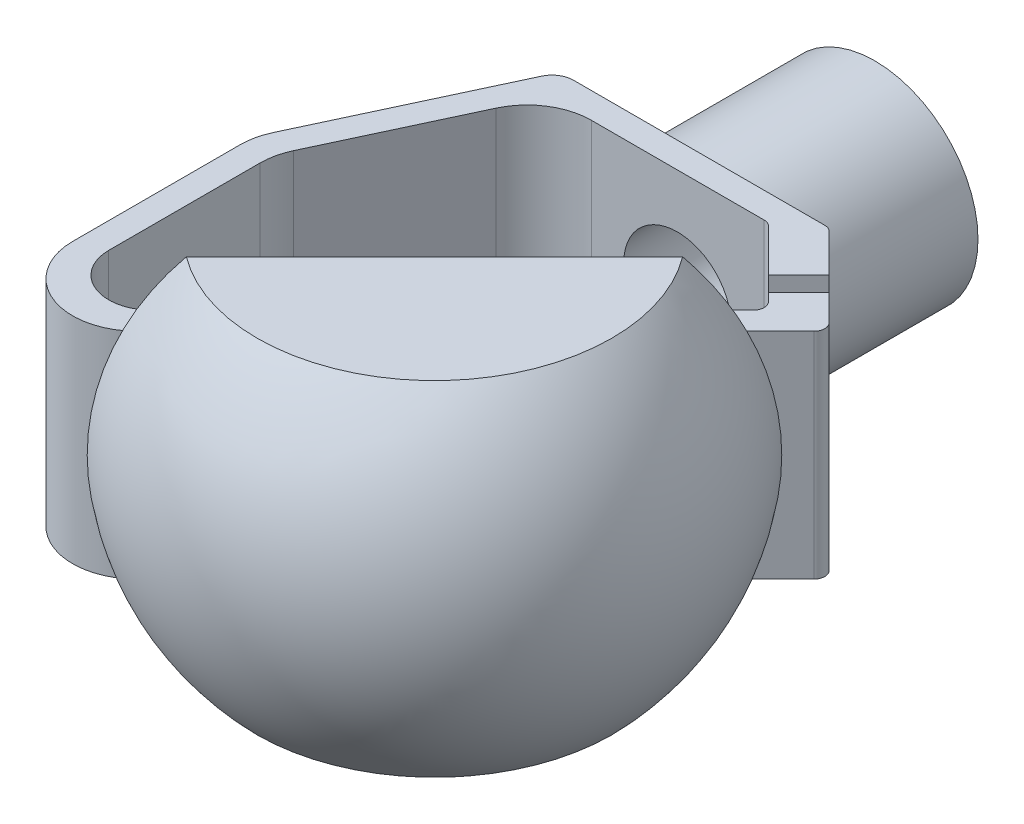
ISO-10303-21;
HEADER;
FILE_DESCRIPTION(('STEP AP214'),'2;1');
FILE_NAME('part.step','',(''),(''),'','','');
FILE_SCHEMA(('AUTOMOTIVE_DESIGN { 1 0 10303 214 1 1 1 1 }'));
ENDSEC;
DATA;
#1=APPLICATION_CONTEXT('core data for automotive mechanical design processes');
#2=APPLICATION_PROTOCOL_DEFINITION('international standard','automotive_design',2000,#1);
#3=PRODUCT_CONTEXT('',#1,'mechanical');
#4=PRODUCT('Part','Part','',(#3));
#5=PRODUCT_RELATED_PRODUCT_CATEGORY('part','',(#4));
#6=PRODUCT_DEFINITION_FORMATION('','',#4);
#7=PRODUCT_DEFINITION_CONTEXT('part definition',#1,'design');
#8=PRODUCT_DEFINITION('design','',#6,#7);
#9=PRODUCT_DEFINITION_SHAPE('','',#8);
#10=(LENGTH_UNIT() NAMED_UNIT(*) SI_UNIT(.MILLI.,.METRE.));
#11=(NAMED_UNIT(*) PLANE_ANGLE_UNIT() SI_UNIT($,.RADIAN.));
#12=(NAMED_UNIT(*) SI_UNIT($,.STERADIAN.) SOLID_ANGLE_UNIT());
#13=UNCERTAINTY_MEASURE_WITH_UNIT(LENGTH_MEASURE(1.E-05),#10,'distance_accuracy_value','');
#14=(GEOMETRIC_REPRESENTATION_CONTEXT(3) GLOBAL_UNCERTAINTY_ASSIGNED_CONTEXT((#13)) GLOBAL_UNIT_ASSIGNED_CONTEXT((#10,
#11,#12)) REPRESENTATION_CONTEXT('',''));
#15=CARTESIAN_POINT('',(0.,0.,0.));
#16=DIRECTION('',(0.,0.,1.));
#17=DIRECTION('',(1.,0.,0.));
#18=AXIS2_PLACEMENT_3D('',#15,#16,#17);
#19=CARTESIAN_POINT('',(0.,0.,0.));
#20=DIRECTION('',(0.,0.,-1.));
#21=DIRECTION('',(-1.,0.,0.));
#22=AXIS2_PLACEMENT_3D('',#19,#20,#21);
#23=PLANE('',#22);
#24=CARTESIAN_POINT('',(0.,0.,0.));
#25=DIRECTION('',(0.,0.,-1.));
#26=DIRECTION('',(-1.,0.,0.));
#27=AXIS2_PLACEMENT_3D('',#24,#25,#26);
#28=CIRCLE('',#27,1.25);
#29=CARTESIAN_POINT('',(-1.25,0.,0.));
#30=VERTEX_POINT('',#29);
#31=EDGE_CURVE('E232',#30,#30,#28,.T.);
#32=ORIENTED_EDGE('',*,*,#31,.F.);
#33=EDGE_LOOP('',(#32));
#34=FACE_BOUND('',#33,.T.);
#35=CARTESIAN_POINT('',(0.,0.,0.));
#36=DIRECTION('',(0.,0.,-1.));
#37=DIRECTION('',(-1.,0.,0.));
#38=AXIS2_PLACEMENT_3D('',#35,#36,#37);
#39=CIRCLE('',#38,2.4);
#40=CARTESIAN_POINT('',(-2.4,0.,0.));
#41=VERTEX_POINT('',#40);
#42=EDGE_CURVE('E412',#41,#41,#39,.T.);
#43=ORIENTED_EDGE('',*,*,#42,.T.);
#44=EDGE_LOOP('',(#43));
#45=FACE_BOUND('',#44,.T.);
#46=ADVANCED_FACE('F38',(#34,#45),#23,.T.);
#47=CARTESIAN_POINT('',(0.,0.,-4.09454545454545));
#48=DIRECTION('',(0.,0.,-1.));
#49=DIRECTION('',(-1.,0.,0.));
#50=AXIS2_PLACEMENT_3D('',#47,#48,#49);
#51=CYLINDRICAL_SURFACE('',#50,2.4);
#52=CARTESIAN_POINT('',(0.,0.,4.));
#53=DIRECTION('',(0.,0.,1.));
#54=DIRECTION('',(1.,0.,0.));
#55=AXIS2_PLACEMENT_3D('',#52,#53,#54);
#56=CIRCLE('',#55,2.4);
#57=CARTESIAN_POINT('',(2.4,0.,4.));
#58=VERTEX_POINT('',#57);
#59=EDGE_CURVE('E409',#58,#58,#56,.F.);
#60=ORIENTED_EDGE('',*,*,#59,.T.);
#61=EDGE_LOOP('',(#60));
#62=FACE_BOUND('',#61,.T.);
#63=ORIENTED_EDGE('',*,*,#42,.F.);
#64=EDGE_LOOP('',(#63));
#65=FACE_BOUND('',#64,.T.);
#66=ADVANCED_FACE('F436',(#62,#65),#51,.T.);
#67=CARTESIAN_POINT('',(0.,2.5,4.));
#68=DIRECTION('',(0.,0.,1.));
#69=DIRECTION('',(1.,0.,0.));
#70=AXIS2_PLACEMENT_3D('',#67,#68,#69);
#71=PLANE('',#70);
#72=ORIENTED_EDGE('',*,*,#59,.F.);
#73=EDGE_LOOP('',(#72));
#74=FACE_BOUND('',#73,.T.);
#75=DIRECTION('',(-1.,0.,0.));
#76=VECTOR('',#75,1.);
#77=CARTESIAN_POINT('',(0.,-2.5,4.));
#78=LINE('',#77,#76);
#79=CARTESIAN_POINT('',(2.83198051533945,-2.5,4.));
#80=VERTEX_POINT('',#79);
#81=CARTESIAN_POINT('',(-3.01931241729199,-2.5,4.));
#82=VERTEX_POINT('',#81);
#83=EDGE_CURVE('E288',#80,#82,#78,.T.);
#84=ORIENTED_EDGE('',*,*,#83,.T.);
#85=DIRECTION('',(0.,-1.,0.));
#86=VECTOR('',#85,1.);
#87=CARTESIAN_POINT('',(-3.01931241729199,2.5,4.));
#88=LINE('',#87,#86);
#89=CARTESIAN_POINT('',(-3.01931241729199,2.5,4.));
#90=VERTEX_POINT('',#89);
#91=EDGE_CURVE('E406',#90,#82,#88,.T.);
#92=ORIENTED_EDGE('',*,*,#91,.F.);
#93=DIRECTION('',(-1.,0.,0.));
#94=VECTOR('',#93,1.);
#95=CARTESIAN_POINT('',(2.83198051533945,2.5,4.));
#96=LINE('',#95,#94);
#97=CARTESIAN_POINT('',(2.83198051533945,2.5,4.));
#98=VERTEX_POINT('',#97);
#99=EDGE_CURVE('E236',#98,#90,#96,.T.);
#100=ORIENTED_EDGE('',*,*,#99,.F.);
#101=DIRECTION('',(0.,-1.,0.));
#102=VECTOR('',#101,1.);
#103=CARTESIAN_POINT('',(2.83198051533945,2.5,4.));
#104=LINE('',#103,#102);
#105=EDGE_CURVE('E287',#98,#80,#104,.T.);
#106=ORIENTED_EDGE('',*,*,#105,.T.);
#107=EDGE_LOOP('',(#84,#92,#100,#106));
#108=FACE_BOUND('',#107,.T.);
#109=ADVANCED_FACE('F441',(#74,#108),#71,.F.);
#110=CARTESIAN_POINT('',(-3.01931241729199,2.5,4.5));
#111=DIRECTION('',(0.,-1.,0.));
#112=DIRECTION('',(0.,0.,-1.));
#113=AXIS2_PLACEMENT_3D('',#110,#111,#112);
#114=CYLINDRICAL_SURFACE('',#113,0.5);
#115=CARTESIAN_POINT('',(-3.01931241729199,-2.5,4.5));
#116=DIRECTION('',(0.,1.,0.));
#117=DIRECTION('',(0.,0.,1.));
#118=AXIS2_PLACEMENT_3D('',#115,#116,#117);
#119=CIRCLE('',#118,0.5);
#120=CARTESIAN_POINT('',(-3.47246631081032,-2.5,4.28869086912965));
#121=VERTEX_POINT('',#120);
#122=EDGE_CURVE('E290',#82,#121,#119,.T.);
#123=ORIENTED_EDGE('',*,*,#122,.T.);
#124=DIRECTION('',(0.,-1.,0.));
#125=VECTOR('',#124,1.);
#126=CARTESIAN_POINT('',(-3.47246631081032,2.5,4.28869086912965));
#127=LINE('',#126,#125);
#128=CARTESIAN_POINT('',(-3.47246631081032,2.5,4.28869086912965));
#129=VERTEX_POINT('',#128);
#130=EDGE_CURVE('E403',#129,#121,#127,.T.);
#131=ORIENTED_EDGE('',*,*,#130,.F.);
#132=CARTESIAN_POINT('',(-3.01931241729199,2.5,4.5));
#133=DIRECTION('',(0.,1.,0.));
#134=DIRECTION('',(0.,0.,1.));
#135=AXIS2_PLACEMENT_3D('',#132,#133,#134);
#136=CIRCLE('',#135,0.5);
#137=EDGE_CURVE('E238',#90,#129,#136,.T.);
#138=ORIENTED_EDGE('',*,*,#137,.F.);
#139=ORIENTED_EDGE('',*,*,#91,.T.);
#140=EDGE_LOOP('',(#123,#131,#138,#139));
#141=FACE_BOUND('',#140,.T.);
#142=ADVANCED_FACE('F450',(#141),#114,.T.);
#143=CARTESIAN_POINT('',(-3.47246631081032,2.5,4.28869086912965));
#144=DIRECTION('',(0.906307787036651,0.,0.422618261740697));
#145=DIRECTION('',(0.422618261740697,0.,-0.906307787036651));
#146=AXIS2_PLACEMENT_3D('',#143,#144,#145);
#147=PLANE('',#146);
#148=DIRECTION('',(-0.422618261740697,0.,0.906307787036651));
#149=VECTOR('',#148,1.);
#150=CARTESIAN_POINT('',(-3.47246631081032,-2.5,4.28869086912965));
#151=LINE('',#150,#149);
#152=CARTESIAN_POINT('',(-5.45946168055498,-2.5,8.54981619056755));
#153=VERTEX_POINT('',#152);
#154=EDGE_CURVE('E292',#121,#153,#151,.T.);
#155=ORIENTED_EDGE('',*,*,#154,.T.);
#156=DIRECTION('',(0.,-1.,0.));
#157=VECTOR('',#156,1.);
#158=CARTESIAN_POINT('',(-5.45946168055498,2.5,8.54981619056755));
#159=LINE('',#158,#157);
#160=CARTESIAN_POINT('',(-5.45946168055498,2.5,8.54981619056755));
#161=VERTEX_POINT('',#160);
#162=EDGE_CURVE('E400',#161,#153,#159,.T.);
#163=ORIENTED_EDGE('',*,*,#162,.F.);
#164=DIRECTION('',(-0.422618261740697,0.,0.906307787036651));
#165=VECTOR('',#164,1.);
#166=CARTESIAN_POINT('',(-3.47246631081032,2.5,4.28869086912965));
#167=LINE('',#166,#165);
#168=EDGE_CURVE('E241',#129,#161,#167,.T.);
#169=ORIENTED_EDGE('',*,*,#168,.F.);
#170=ORIENTED_EDGE('',*,*,#130,.T.);
#171=EDGE_LOOP('',(#155,#163,#169,#170));
#172=FACE_BOUND('',#171,.T.);
#173=ADVANCED_FACE('F456',(#172),#147,.F.);
#174=CARTESIAN_POINT('',(-4.1,2.5,9.18374358317859));
#175=DIRECTION('',(0.,-1.,0.));
#176=DIRECTION('',(0.,0.,-1.));
#177=AXIS2_PLACEMENT_3D('',#174,#175,#176);
#178=CYLINDRICAL_SURFACE('',#177,1.5);
#179=CARTESIAN_POINT('',(-4.1,-2.5,9.18374358317859));
#180=DIRECTION('',(0.,1.,0.));
#181=DIRECTION('',(0.,0.,1.));
#182=AXIS2_PLACEMENT_3D('',#179,#180,#181);
#183=CIRCLE('',#182,1.5);
#184=CARTESIAN_POINT('',(-5.6,-2.5,9.18374358317859));
#185=VERTEX_POINT('',#184);
#186=EDGE_CURVE('E294',#153,#185,#183,.T.);
#187=ORIENTED_EDGE('',*,*,#186,.T.);
#188=DIRECTION('',(0.,-1.,0.));
#189=VECTOR('',#188,1.);
#190=CARTESIAN_POINT('',(-5.6,2.5,9.18374358317859));
#191=LINE('',#190,#189);
#192=CARTESIAN_POINT('',(-5.6,2.5,9.18374358317859));
#193=VERTEX_POINT('',#192);
#194=EDGE_CURVE('E397',#193,#185,#191,.T.);
#195=ORIENTED_EDGE('',*,*,#194,.F.);
#196=CARTESIAN_POINT('',(-4.1,2.5,9.18374358317859));
#197=DIRECTION('',(0.,1.,0.));
#198=DIRECTION('',(0.,0.,1.));
#199=AXIS2_PLACEMENT_3D('',#196,#197,#198);
#200=CIRCLE('',#199,1.5);
#201=EDGE_CURVE('E243',#161,#193,#200,.T.);
#202=ORIENTED_EDGE('',*,*,#201,.F.);
#203=ORIENTED_EDGE('',*,*,#162,.T.);
#204=EDGE_LOOP('',(#187,#195,#202,#203));
#205=FACE_BOUND('',#204,.T.);
#206=ADVANCED_FACE('F460',(#205),#178,.T.);
#207=CARTESIAN_POINT('',(-5.6,2.5,9.18374358317859));
#208=DIRECTION('',(1.,0.,0.));
#209=DIRECTION('',(0.,0.,-1.));
#210=AXIS2_PLACEMENT_3D('',#207,#208,#209);
#211=PLANE('',#210);
#212=DIRECTION('',(0.,0.,1.));
#213=VECTOR('',#212,1.);
#214=CARTESIAN_POINT('',(-5.6,-2.5,9.18374358317859));
#215=LINE('',#214,#213);
#216=CARTESIAN_POINT('',(-5.6,-2.5,13.0840620433564));
#217=VERTEX_POINT('',#216);
#218=EDGE_CURVE('E296',#185,#217,#215,.T.);
#219=ORIENTED_EDGE('',*,*,#218,.T.);
#220=DIRECTION('',(0.,-1.,0.));
#221=VECTOR('',#220,1.);
#222=CARTESIAN_POINT('',(-5.6,2.5,13.0840620433564));
#223=LINE('',#222,#221);
#224=CARTESIAN_POINT('',(-5.6,2.5,13.0840620433564));
#225=VERTEX_POINT('',#224);
#226=EDGE_CURVE('E394',#225,#217,#223,.T.);
#227=ORIENTED_EDGE('',*,*,#226,.F.);
#228=DIRECTION('',(0.,0.,1.));
#229=VECTOR('',#228,1.);
#230=CARTESIAN_POINT('',(-5.6,2.5,9.18374358317859));
#231=LINE('',#230,#229);
#232=EDGE_CURVE('E245',#193,#225,#231,.T.);
#233=ORIENTED_EDGE('',*,*,#232,.F.);
#234=ORIENTED_EDGE('',*,*,#194,.T.);
#235=EDGE_LOOP('',(#219,#227,#233,#234));
#236=FACE_BOUND('',#235,.T.);
#237=ADVANCED_FACE('F464',(#236),#211,.F.);
#238=CARTESIAN_POINT('',(-4.1,2.5,13.0840620433564));
#239=DIRECTION('',(0.,-1.,0.));
#240=DIRECTION('',(0.,0.,-1.));
#241=AXIS2_PLACEMENT_3D('',#238,#239,#240);
#242=CYLINDRICAL_SURFACE('',#241,1.5);
#243=CARTESIAN_POINT('',(-4.1,-2.5,13.0840620433564));
#244=DIRECTION('',(0.,1.,0.));
#245=DIRECTION('',(0.,0.,1.));
#246=AXIS2_PLACEMENT_3D('',#243,#244,#245);
#247=CIRCLE('',#246,1.5);
#248=CARTESIAN_POINT('',(-3.03933982822018,-2.5,14.1447222151363));
#249=VERTEX_POINT('',#248);
#250=EDGE_CURVE('E298',#217,#249,#247,.T.);
#251=ORIENTED_EDGE('',*,*,#250,.T.);
#252=DIRECTION('',(0.,-1.,0.));
#253=VECTOR('',#252,1.);
#254=CARTESIAN_POINT('',(-3.03933982822018,2.5,14.1447222151363));
#255=LINE('',#254,#253);
#256=CARTESIAN_POINT('',(-3.03933982822018,2.5,14.1447222151363));
#257=VERTEX_POINT('',#256);
#258=EDGE_CURVE('E391',#257,#249,#255,.T.);
#259=ORIENTED_EDGE('',*,*,#258,.F.);
#260=CARTESIAN_POINT('',(-4.1,2.5,13.0840620433564));
#261=DIRECTION('',(0.,1.,0.));
#262=DIRECTION('',(0.,0.,1.));
#263=AXIS2_PLACEMENT_3D('',#260,#261,#262);
#264=CIRCLE('',#263,1.5);
#265=EDGE_CURVE('E247',#225,#257,#264,.T.);
#266=ORIENTED_EDGE('',*,*,#265,.F.);
#267=ORIENTED_EDGE('',*,*,#226,.T.);
#268=EDGE_LOOP('',(#251,#259,#266,#267));
#269=FACE_BOUND('',#268,.T.);
#270=ADVANCED_FACE('F468',(#269),#242,.T.);
#271=CARTESIAN_POINT('',(-3.03933982822018,2.5,14.1447222151363));
#272=DIRECTION('',(-0.70710678118654,0.,-0.707106781186555));
#273=DIRECTION('',(-0.707106781186555,0.,0.70710678118654));
#274=AXIS2_PLACEMENT_3D('',#271,#272,#273);
#275=PLANE('',#274);
#276=CARTESIAN_POINT('',(0.424264068711882,0.,10.6811183182042));
#277=DIRECTION('',(-0.707106781186548,0.,-0.707106781186547));
#278=DIRECTION('',(-0.707106781186547,0.,0.707106781186548));
#279=AXIS2_PLACEMENT_3D('',#276,#277,#278);
#280=CIRCLE('',#279,5.71860997096323);
#281=CARTESIAN_POINT('',(4.06105523676107,2.5,7.04432715015517));
#282=VERTEX_POINT('',#281);
#283=CARTESIAN_POINT('',(4.061055236761,-2.5,7.04432715015507));
#284=VERTEX_POINT('',#283);
#285=EDGE_CURVE('E228',#282,#284,#280,.T.);
#286=ORIENTED_EDGE('',*,*,#285,.T.);
#287=DIRECTION('',(0.707106781186555,0.,-0.70710678118654));
#288=VECTOR('',#287,1.);
#289=CARTESIAN_POINT('',(-3.03933982822018,-2.5,14.1447222151363));
#290=LINE('',#289,#288);
#291=CARTESIAN_POINT('',(4.84368145112784,-2.5,6.26170093578842));
#292=VERTEX_POINT('',#291);
#293=EDGE_CURVE('E300',#284,#292,#290,.T.);
#294=ORIENTED_EDGE('',*,*,#293,.T.);
#295=DIRECTION('',(0.,-1.,0.));
#296=VECTOR('',#295,1.);
#297=CARTESIAN_POINT('',(4.84368145112784,2.5,6.26170093578842));
#298=LINE('',#297,#296);
#299=CARTESIAN_POINT('',(4.84368145112784,2.5,6.26170093578842));
#300=VERTEX_POINT('',#299);
#301=EDGE_CURVE('E388',#300,#292,#298,.T.);
#302=ORIENTED_EDGE('',*,*,#301,.F.);
#303=DIRECTION('',(0.707106781186555,0.,-0.70710678118654));
#304=VECTOR('',#303,1.);
#305=CARTESIAN_POINT('',(-3.03933982822018,2.5,14.1447222151363));
#306=LINE('',#305,#304);
#307=EDGE_CURVE('E249',#282,#300,#306,.T.);
#308=ORIENTED_EDGE('',*,*,#307,.F.);
#309=EDGE_LOOP('',(#286,#294,#302,#308));
#310=FACE_BOUND('',#309,.T.);
#311=ADVANCED_FACE('F472',(#310),#275,.F.);
#312=CARTESIAN_POINT('',(4.66690475583121,2.5,6.08492424049178));
#313=DIRECTION('',(0.,-1.,0.));
#314=DIRECTION('',(0.,0.,-1.));
#315=AXIS2_PLACEMENT_3D('',#312,#313,#314);
#316=CYLINDRICAL_SURFACE('',#315,0.25);
#317=CARTESIAN_POINT('',(4.66690475583121,-2.5,6.08492424049178));
#318=DIRECTION('',(0.,1.,0.));
#319=DIRECTION('',(0.,0.,1.));
#320=AXIS2_PLACEMENT_3D('',#317,#318,#319);
#321=CIRCLE('',#320,0.25);
#322=CARTESIAN_POINT('',(4.84368145112784,-2.5,5.90814754519514));
#323=VERTEX_POINT('',#322);
#324=EDGE_CURVE('E303',#292,#323,#321,.T.);
#325=ORIENTED_EDGE('',*,*,#324,.T.);
#326=DIRECTION('',(0.,-1.,0.));
#327=VECTOR('',#326,1.);
#328=CARTESIAN_POINT('',(4.84368145112784,2.5,5.90814754519514));
#329=LINE('',#328,#327);
#330=CARTESIAN_POINT('',(4.84368145112784,2.5,5.90814754519514));
#331=VERTEX_POINT('',#330);
#332=EDGE_CURVE('E385',#331,#323,#329,.T.);
#333=ORIENTED_EDGE('',*,*,#332,.F.);
#334=CARTESIAN_POINT('',(4.66690475583121,2.5,6.08492424049178));
#335=DIRECTION('',(0.,1.,0.));
#336=DIRECTION('',(0.,0.,1.));
#337=AXIS2_PLACEMENT_3D('',#334,#335,#336);
#338=CIRCLE('',#337,0.25);
#339=EDGE_CURVE('E253',#300,#331,#338,.T.);
#340=ORIENTED_EDGE('',*,*,#339,.F.);
#341=ORIENTED_EDGE('',*,*,#301,.T.);
#342=EDGE_LOOP('',(#325,#333,#340,#341));
#343=FACE_BOUND('',#342,.T.);
#344=ADVANCED_FACE('F476',(#343),#316,.T.);
#345=CARTESIAN_POINT('',(4.24264068711928,2.5,5.30710678118657));
#346=DIRECTION('',(-0.707106781186552,0.,0.707106781186543));
#347=DIRECTION('',(0.707106781186543,0.,0.707106781186552));
#348=AXIS2_PLACEMENT_3D('',#345,#346,#347);
#349=PLANE('',#348);
#350=DIRECTION('',(-0.707106781186543,0.,-0.707106781186552));
#351=VECTOR('',#350,1.);
#352=CARTESIAN_POINT('',(4.24264068711928,-2.5,5.30710678118657));
#353=LINE('',#352,#351);
#354=CARTESIAN_POINT('',(4.24264068711928,-2.5,5.30710678118657));
#355=VERTEX_POINT('',#354);
#356=EDGE_CURVE('E305',#323,#355,#353,.T.);
#357=ORIENTED_EDGE('',*,*,#356,.T.);
#358=DIRECTION('',(0.,-1.,0.));
#359=VECTOR('',#358,1.);
#360=CARTESIAN_POINT('',(4.24264068711928,2.5,5.30710678118657));
#361=LINE('',#360,#359);
#362=CARTESIAN_POINT('',(4.24264068711928,2.5,5.30710678118657));
#363=VERTEX_POINT('',#362);
#364=EDGE_CURVE('E382',#363,#355,#361,.T.);
#365=ORIENTED_EDGE('',*,*,#364,.F.);
#366=DIRECTION('',(-0.707106781186543,0.,-0.707106781186552));
#367=VECTOR('',#366,1.);
#368=CARTESIAN_POINT('',(4.24264068711928,2.5,5.30710678118657));
#369=LINE('',#368,#367);
#370=EDGE_CURVE('E255',#331,#363,#369,.T.);
#371=ORIENTED_EDGE('',*,*,#370,.F.);
#372=ORIENTED_EDGE('',*,*,#332,.T.);
#373=EDGE_LOOP('',(#357,#365,#371,#372));
#374=FACE_BOUND('',#373,.T.);
#375=ADVANCED_FACE('F480',(#374),#349,.F.);
#376=CARTESIAN_POINT('',(3.53553390593273,2.5,6.01421356237312));
#377=DIRECTION('',(0.707106781186544,0.,0.707106781186551));
#378=DIRECTION('',(0.707106781186551,0.,-0.707106781186544));
#379=AXIS2_PLACEMENT_3D('',#376,#377,#378);
#380=PLANE('',#379);
#381=DIRECTION('',(-0.707106781186551,0.,0.707106781186544));
#382=VECTOR('',#381,1.);
#383=CARTESIAN_POINT('',(3.53553390593273,-2.5,6.01421356237312));
#384=LINE('',#383,#382);
#385=CARTESIAN_POINT('',(3.53553390593273,-2.5,6.01421356237312));
#386=VERTEX_POINT('',#385);
#387=EDGE_CURVE('E307',#355,#386,#384,.T.);
#388=ORIENTED_EDGE('',*,*,#387,.T.);
#389=DIRECTION('',(0.,-1.,0.));
#390=VECTOR('',#389,1.);
#391=CARTESIAN_POINT('',(3.53553390593273,2.5,6.01421356237312));
#392=LINE('',#391,#390);
#393=CARTESIAN_POINT('',(3.53553390593273,2.5,6.01421356237312));
#394=VERTEX_POINT('',#393);
#395=EDGE_CURVE('E379',#394,#386,#392,.T.);
#396=ORIENTED_EDGE('',*,*,#395,.F.);
#397=DIRECTION('',(-0.707106781186551,0.,0.707106781186544));
#398=VECTOR('',#397,1.);
#399=CARTESIAN_POINT('',(3.53553390593273,2.5,6.01421356237312));
#400=LINE('',#399,#398);
#401=EDGE_CURVE('E257',#363,#394,#400,.T.);
#402=ORIENTED_EDGE('',*,*,#401,.F.);
#403=ORIENTED_EDGE('',*,*,#364,.T.);
#404=EDGE_LOOP('',(#388,#396,#402,#403));
#405=FACE_BOUND('',#404,.T.);
#406=ADVANCED_FACE('F484',(#405),#380,.F.);
#407=CARTESIAN_POINT('',(3.71231060122937,2.5,6.19099025766976));
#408=DIRECTION('',(0.707106781186554,0.,-0.707106781186541));
#409=DIRECTION('',(-0.707106781186541,0.,-0.707106781186554));
#410=AXIS2_PLACEMENT_3D('',#407,#408,#409);
#411=PLANE('',#410);
#412=DIRECTION('',(0.707106781186541,0.,0.707106781186554));
#413=VECTOR('',#412,1.);
#414=CARTESIAN_POINT('',(3.71231060122937,-2.5,6.19099025766976));
#415=LINE('',#414,#413);
#416=CARTESIAN_POINT('',(3.71231060122937,-2.5,6.19099025766976));
#417=VERTEX_POINT('',#416);
#418=EDGE_CURVE('E309',#386,#417,#415,.T.);
#419=ORIENTED_EDGE('',*,*,#418,.T.);
#420=DIRECTION('',(0.,-1.,0.));
#421=VECTOR('',#420,1.);
#422=CARTESIAN_POINT('',(3.71231060122937,2.5,6.19099025766976));
#423=LINE('',#422,#421);
#424=CARTESIAN_POINT('',(3.71231060122937,2.5,6.19099025766976));
#425=VERTEX_POINT('',#424);
#426=EDGE_CURVE('E376',#425,#417,#423,.T.);
#427=ORIENTED_EDGE('',*,*,#426,.F.);
#428=DIRECTION('',(0.707106781186541,0.,0.707106781186554));
#429=VECTOR('',#428,1.);
#430=CARTESIAN_POINT('',(3.71231060122937,2.5,6.19099025766976));
#431=LINE('',#430,#429);
#432=EDGE_CURVE('E259',#394,#425,#431,.T.);
#433=ORIENTED_EDGE('',*,*,#432,.F.);
#434=ORIENTED_EDGE('',*,*,#395,.T.);
#435=EDGE_LOOP('',(#419,#427,#433,#434));
#436=FACE_BOUND('',#435,.T.);
#437=ADVANCED_FACE('F488',(#436),#411,.F.);
#438=CARTESIAN_POINT('',(3.53553390593273,2.5,6.36776695296639));
#439=DIRECTION('',(0.,-1.,0.));
#440=DIRECTION('',(0.,0.,-1.));
#441=AXIS2_PLACEMENT_3D('',#438,#439,#440);
#442=CYLINDRICAL_SURFACE('',#441,0.250000000000001);
#443=CARTESIAN_POINT('',(3.53553390593273,-2.5,6.36776695296639));
#444=DIRECTION('',(0.,-1.,0.));
#445=DIRECTION('',(0.,0.,1.));
#446=AXIS2_PLACEMENT_3D('',#443,#444,#445);
#447=CIRCLE('',#446,0.250000000000001);
#448=CARTESIAN_POINT('',(3.71231060122936,-2.5,6.54454364826303));
#449=VERTEX_POINT('',#448);
#450=EDGE_CURVE('E311',#417,#449,#447,.T.);
#451=ORIENTED_EDGE('',*,*,#450,.T.);
#452=DIRECTION('',(0.,-1.,0.));
#453=VECTOR('',#452,1.);
#454=CARTESIAN_POINT('',(3.71231060122936,2.5,6.54454364826303));
#455=LINE('',#454,#453);
#456=CARTESIAN_POINT('',(3.71231060122936,2.5,6.54454364826303));
#457=VERTEX_POINT('',#456);
#458=EDGE_CURVE('E373',#457,#449,#455,.T.);
#459=ORIENTED_EDGE('',*,*,#458,.F.);
#460=CARTESIAN_POINT('',(3.53553390593273,2.5,6.36776695296639));
#461=DIRECTION('',(0.,-1.,0.));
#462=DIRECTION('',(0.,0.,1.));
#463=AXIS2_PLACEMENT_3D('',#460,#461,#462);
#464=CIRCLE('',#463,0.250000000000001);
#465=EDGE_CURVE('E261',#425,#457,#464,.T.);
#466=ORIENTED_EDGE('',*,*,#465,.F.);
#467=ORIENTED_EDGE('',*,*,#426,.T.);
#468=EDGE_LOOP('',(#451,#459,#466,#467));
#469=FACE_BOUND('',#468,.T.);
#470=ADVANCED_FACE('F492',(#469),#442,.F.);
#471=CARTESIAN_POINT('',(-3.29289321881346,2.5,13.5497474683057));
#472=DIRECTION('',(0.707106781186539,0.,0.707106781186556));
#473=DIRECTION('',(0.707106781186556,0.,-0.707106781186539));
#474=AXIS2_PLACEMENT_3D('',#471,#472,#473);
#475=PLANE('',#474);
#476=DIRECTION('',(-0.707106781186556,0.,0.707106781186539));
#477=VECTOR('',#476,1.);
#478=CARTESIAN_POINT('',(-3.29289321881346,-2.5,13.5497474683057));
#479=LINE('',#478,#477);
#480=CARTESIAN_POINT('',(-3.29289321881346,-2.5,13.5497474683057));
#481=VERTEX_POINT('',#480);
#482=EDGE_CURVE('E313',#449,#481,#479,.T.);
#483=ORIENTED_EDGE('',*,*,#482,.T.);
#484=DIRECTION('',(0.,-1.,0.));
#485=VECTOR('',#484,1.);
#486=CARTESIAN_POINT('',(-3.29289321881346,2.5,13.5497474683057));
#487=LINE('',#486,#485);
#488=CARTESIAN_POINT('',(-3.29289321881346,2.5,13.5497474683057));
#489=VERTEX_POINT('',#488);
#490=EDGE_CURVE('E370',#489,#481,#487,.T.);
#491=ORIENTED_EDGE('',*,*,#490,.F.);
#492=DIRECTION('',(-0.707106781186556,0.,0.707106781186539));
#493=VECTOR('',#492,1.);
#494=CARTESIAN_POINT('',(-3.29289321881346,2.5,13.5497474683057));
#495=LINE('',#494,#493);
#496=EDGE_CURVE('E263',#457,#489,#495,.T.);
#497=ORIENTED_EDGE('',*,*,#496,.F.);
#498=ORIENTED_EDGE('',*,*,#458,.T.);
#499=EDGE_LOOP('',(#483,#491,#497,#498));
#500=FACE_BOUND('',#499,.T.);
#501=ADVANCED_FACE('F496',(#500),#475,.F.);
#502=CARTESIAN_POINT('',(-4.,2.5,12.8426406871191));
#503=DIRECTION('',(0.,-1.,0.));
#504=DIRECTION('',(0.,0.,-1.));
#505=AXIS2_PLACEMENT_3D('',#502,#503,#504);
#506=CYLINDRICAL_SURFACE('',#505,0.999999999999999);
#507=CARTESIAN_POINT('',(-4.,-2.5,12.8426406871191));
#508=DIRECTION('',(0.,-1.,0.));
#509=DIRECTION('',(0.,0.,1.));
#510=AXIS2_PLACEMENT_3D('',#507,#508,#509);
#511=CIRCLE('',#510,0.999999999999999);
#512=CARTESIAN_POINT('',(-5.,-2.5,12.8426406871191));
#513=VERTEX_POINT('',#512);
#514=EDGE_CURVE('E315',#481,#513,#511,.T.);
#515=ORIENTED_EDGE('',*,*,#514,.T.);
#516=DIRECTION('',(0.,-1.,0.));
#517=VECTOR('',#516,1.);
#518=CARTESIAN_POINT('',(-5.,2.5,12.8426406871191));
#519=LINE('',#518,#517);
#520=CARTESIAN_POINT('',(-5.,2.5,12.8426406871191));
#521=VERTEX_POINT('',#520);
#522=EDGE_CURVE('E367',#521,#513,#519,.T.);
#523=ORIENTED_EDGE('',*,*,#522,.F.);
#524=CARTESIAN_POINT('',(-4.,2.5,12.8426406871191));
#525=DIRECTION('',(0.,-1.,0.));
#526=DIRECTION('',(0.,0.,1.));
#527=AXIS2_PLACEMENT_3D('',#524,#525,#526);
#528=CIRCLE('',#527,0.999999999999999);
#529=EDGE_CURVE('E265',#489,#521,#528,.T.);
#530=ORIENTED_EDGE('',*,*,#529,.F.);
#531=ORIENTED_EDGE('',*,*,#490,.T.);
#532=EDGE_LOOP('',(#515,#523,#530,#531));
#533=FACE_BOUND('',#532,.T.);
#534=ADVANCED_FACE('F500',(#533),#506,.F.);
#535=CARTESIAN_POINT('',(-5.,2.5,9.31676038076436));
#536=DIRECTION('',(-1.,0.,0.));
#537=DIRECTION('',(0.,0.,1.));
#538=AXIS2_PLACEMENT_3D('',#535,#536,#537);
#539=PLANE('',#538);
#540=DIRECTION('',(0.,0.,-1.));
#541=VECTOR('',#540,1.);
#542=CARTESIAN_POINT('',(-5.,-2.5,9.31676038076436));
#543=LINE('',#542,#541);
#544=CARTESIAN_POINT('',(-5.,-2.5,9.31676038076436));
#545=VERTEX_POINT('',#544);
#546=EDGE_CURVE('E317',#513,#545,#543,.T.);
#547=ORIENTED_EDGE('',*,*,#546,.T.);
#548=DIRECTION('',(0.,-1.,0.));
#549=VECTOR('',#548,1.);
#550=CARTESIAN_POINT('',(-5.,2.5,9.31676038076436));
#551=LINE('',#550,#549);
#552=CARTESIAN_POINT('',(-5.,2.5,9.31676038076436));
#553=VERTEX_POINT('',#552);
#554=EDGE_CURVE('E364',#553,#545,#551,.T.);
#555=ORIENTED_EDGE('',*,*,#554,.F.);
#556=DIRECTION('',(0.,0.,-1.));
#557=VECTOR('',#556,1.);
#558=CARTESIAN_POINT('',(-5.,2.5,9.31676038076436));
#559=LINE('',#558,#557);
#560=EDGE_CURVE('E267',#521,#553,#559,.T.);
#561=ORIENTED_EDGE('',*,*,#560,.F.);
#562=ORIENTED_EDGE('',*,*,#522,.T.);
#563=EDGE_LOOP('',(#547,#555,#561,#562));
#564=FACE_BOUND('',#563,.T.);
#565=ADVANCED_FACE('F504',(#564),#539,.F.);
#566=CARTESIAN_POINT('',(-3.5,2.5,9.31676038076436));
#567=DIRECTION('',(0.,-1.,0.));
#568=DIRECTION('',(0.,0.,-1.));
#569=AXIS2_PLACEMENT_3D('',#566,#567,#568);
#570=CYLINDRICAL_SURFACE('',#569,1.5);
#571=CARTESIAN_POINT('',(-3.5,-2.5,9.31676038076436));
#572=DIRECTION('',(0.,-1.,0.));
#573=DIRECTION('',(0.,0.,1.));
#574=AXIS2_PLACEMENT_3D('',#571,#572,#573);
#575=CIRCLE('',#574,1.5);
#576=CARTESIAN_POINT('',(-4.85946168055497,-2.5,8.68283298815331));
#577=VERTEX_POINT('',#576);
#578=EDGE_CURVE('E319',#545,#577,#575,.T.);
#579=ORIENTED_EDGE('',*,*,#578,.T.);
#580=DIRECTION('',(0.,-1.,0.));
#581=VECTOR('',#580,1.);
#582=CARTESIAN_POINT('',(-4.85946168055497,2.5,8.68283298815331));
#583=LINE('',#582,#581);
#584=CARTESIAN_POINT('',(-4.85946168055497,2.5,8.68283298815331));
#585=VERTEX_POINT('',#584);
#586=EDGE_CURVE('E361',#585,#577,#583,.T.);
#587=ORIENTED_EDGE('',*,*,#586,.F.);
#588=CARTESIAN_POINT('',(-3.5,2.5,9.31676038076436));
#589=DIRECTION('',(0.,-1.,0.));
#590=DIRECTION('',(0.,0.,1.));
#591=AXIS2_PLACEMENT_3D('',#588,#589,#590);
#592=CIRCLE('',#591,1.5);
#593=EDGE_CURVE('E269',#553,#585,#592,.T.);
#594=ORIENTED_EDGE('',*,*,#593,.F.);
#595=ORIENTED_EDGE('',*,*,#554,.T.);
#596=EDGE_LOOP('',(#579,#587,#594,#595));
#597=FACE_BOUND('',#596,.T.);
#598=ADVANCED_FACE('F508',(#597),#570,.F.);
#599=CARTESIAN_POINT('',(-3.35946168055498,2.5,5.46607260738896));
#600=DIRECTION('',(-0.906307787036651,0.,-0.422618261740697));
#601=DIRECTION('',(-0.422618261740697,0.,0.906307787036651));
#602=AXIS2_PLACEMENT_3D('',#599,#600,#601);
#603=PLANE('',#602);
#604=DIRECTION('',(0.422618261740697,0.,-0.906307787036651));
#605=VECTOR('',#604,1.);
#606=CARTESIAN_POINT('',(-3.35946168055498,-2.5,5.46607260738896));
#607=LINE('',#606,#605);
#608=CARTESIAN_POINT('',(-3.35946168055498,-2.5,5.46607260738896));
#609=VERTEX_POINT('',#608);
#610=EDGE_CURVE('E321',#577,#609,#607,.T.);
#611=ORIENTED_EDGE('',*,*,#610,.T.);
#612=DIRECTION('',(0.,-1.,0.));
#613=VECTOR('',#612,1.);
#614=CARTESIAN_POINT('',(-3.35946168055498,2.5,5.46607260738896));
#615=LINE('',#614,#613);
#616=CARTESIAN_POINT('',(-3.35946168055498,2.5,5.46607260738896));
#617=VERTEX_POINT('',#616);
#618=EDGE_CURVE('E358',#617,#609,#615,.T.);
#619=ORIENTED_EDGE('',*,*,#618,.F.);
#620=DIRECTION('',(0.422618261740697,0.,-0.906307787036651));
#621=VECTOR('',#620,1.);
#622=CARTESIAN_POINT('',(-3.35946168055498,2.5,5.46607260738896));
#623=LINE('',#622,#621);
#624=EDGE_CURVE('E271',#585,#617,#623,.T.);
#625=ORIENTED_EDGE('',*,*,#624,.F.);
#626=ORIENTED_EDGE('',*,*,#586,.T.);
#627=EDGE_LOOP('',(#611,#619,#625,#626));
#628=FACE_BOUND('',#627,.T.);
#629=ADVANCED_FACE('F512',(#628),#603,.F.);
#630=CARTESIAN_POINT('',(-2.,2.5,6.1));
#631=DIRECTION('',(0.,-1.,0.));
#632=DIRECTION('',(0.,0.,-1.));
#633=AXIS2_PLACEMENT_3D('',#630,#631,#632);
#634=CYLINDRICAL_SURFACE('',#633,1.5);
#635=CARTESIAN_POINT('',(-2.,-2.5,6.1));
#636=DIRECTION('',(0.,-1.,0.));
#637=DIRECTION('',(0.,0.,1.));
#638=AXIS2_PLACEMENT_3D('',#635,#636,#637);
#639=CIRCLE('',#638,1.5);
#640=CARTESIAN_POINT('',(-2.,-2.5,4.6));
#641=VERTEX_POINT('',#640);
#642=EDGE_CURVE('E323',#609,#641,#639,.T.);
#643=ORIENTED_EDGE('',*,*,#642,.T.);
#644=DIRECTION('',(0.,-1.,0.));
#645=VECTOR('',#644,1.);
#646=CARTESIAN_POINT('',(-2.,2.5,4.6));
#647=LINE('',#646,#645);
#648=CARTESIAN_POINT('',(-2.,2.5,4.6));
#649=VERTEX_POINT('',#648);
#650=EDGE_CURVE('E355',#649,#641,#647,.T.);
#651=ORIENTED_EDGE('',*,*,#650,.F.);
#652=CARTESIAN_POINT('',(-2.,2.5,6.1));
#653=DIRECTION('',(0.,-1.,0.));
#654=DIRECTION('',(0.,0.,1.));
#655=AXIS2_PLACEMENT_3D('',#652,#653,#654);
#656=CIRCLE('',#655,1.5);
#657=EDGE_CURVE('E273',#617,#649,#656,.T.);
#658=ORIENTED_EDGE('',*,*,#657,.F.);
#659=ORIENTED_EDGE('',*,*,#618,.T.);
#660=EDGE_LOOP('',(#643,#651,#658,#659));
#661=FACE_BOUND('',#660,.T.);
#662=ADVANCED_FACE('F516',(#661),#634,.F.);
#663=CARTESIAN_POINT('',(2.01776695296635,2.5,4.6));
#664=DIRECTION('',(0.,0.,-1.));
#665=DIRECTION('',(-1.,0.,0.));
#666=AXIS2_PLACEMENT_3D('',#663,#664,#665);
#667=PLANE('',#666);
#668=CARTESIAN_POINT('',(0.,0.,4.6));
#669=DIRECTION('',(0.,0.,-1.));
#670=DIRECTION('',(-1.,0.,0.));
#671=AXIS2_PLACEMENT_3D('',#668,#669,#670);
#672=CIRCLE('',#671,1.25);
#673=CARTESIAN_POINT('',(-1.25,0.,4.6));
#674=VERTEX_POINT('',#673);
#675=EDGE_CURVE('E235',#674,#674,#672,.T.);
#676=ORIENTED_EDGE('',*,*,#675,.T.);
#677=EDGE_LOOP('',(#676));
#678=FACE_BOUND('',#677,.T.);
#679=DIRECTION('',(1.,0.,0.));
#680=VECTOR('',#679,1.);
#681=CARTESIAN_POINT('',(2.01776695296635,-2.5,4.6));
#682=LINE('',#681,#680);
#683=CARTESIAN_POINT('',(2.01776695296635,-2.5,4.6));
#684=VERTEX_POINT('',#683);
#685=EDGE_CURVE('E326',#641,#684,#682,.T.);
#686=ORIENTED_EDGE('',*,*,#685,.T.);
#687=DIRECTION('',(0.,-1.,0.));
#688=VECTOR('',#687,1.);
#689=CARTESIAN_POINT('',(2.01776695296635,2.5,4.6));
#690=LINE('',#689,#688);
#691=CARTESIAN_POINT('',(2.01776695296635,2.5,4.6));
#692=VERTEX_POINT('',#691);
#693=EDGE_CURVE('E352',#692,#684,#690,.T.);
#694=ORIENTED_EDGE('',*,*,#693,.F.);
#695=DIRECTION('',(1.,0.,0.));
#696=VECTOR('',#695,1.);
#697=CARTESIAN_POINT('',(0.,2.5,4.6));
#698=LINE('',#697,#696);
#699=EDGE_CURVE('E275',#649,#692,#698,.T.);
#700=ORIENTED_EDGE('',*,*,#699,.F.);
#701=ORIENTED_EDGE('',*,*,#650,.T.);
#702=EDGE_LOOP('',(#686,#694,#700,#701));
#703=FACE_BOUND('',#702,.T.);
#704=ADVANCED_FACE('F418',(#678,#703),#667,.F.);
#705=CARTESIAN_POINT('',(2.01776695296635,2.5,4.85));
#706=DIRECTION('',(0.,-1.,0.));
#707=DIRECTION('',(0.,0.,-1.));
#708=AXIS2_PLACEMENT_3D('',#705,#706,#707);
#709=CYLINDRICAL_SURFACE('',#708,0.250000000000001);
#710=CARTESIAN_POINT('',(2.01776695296635,-2.5,4.85));
#711=DIRECTION('',(0.,-1.,0.));
#712=DIRECTION('',(0.,0.,-1.));
#713=AXIS2_PLACEMENT_3D('',#710,#711,#712);
#714=CIRCLE('',#713,0.250000000000001);
#715=CARTESIAN_POINT('',(2.19454364826299,-2.5,4.67322330470336));
#716=VERTEX_POINT('',#715);
#717=EDGE_CURVE('E328',#684,#716,#714,.T.);
#718=ORIENTED_EDGE('',*,*,#717,.T.);
#719=DIRECTION('',(0.,-1.,0.));
#720=VECTOR('',#719,1.);
#721=CARTESIAN_POINT('',(2.19454364826299,2.5,4.67322330470336));
#722=LINE('',#721,#720);
#723=CARTESIAN_POINT('',(2.19454364826299,2.5,4.67322330470336));
#724=VERTEX_POINT('',#723);
#725=EDGE_CURVE('E349',#724,#716,#722,.T.);
#726=ORIENTED_EDGE('',*,*,#725,.F.);
#727=CARTESIAN_POINT('',(2.01776695296635,2.5,4.85));
#728=DIRECTION('',(0.,-1.,0.));
#729=DIRECTION('',(0.,0.,-1.));
#730=AXIS2_PLACEMENT_3D('',#727,#728,#729);
#731=CIRCLE('',#730,0.250000000000001);
#732=EDGE_CURVE('E277',#692,#724,#731,.T.);
#733=ORIENTED_EDGE('',*,*,#732,.F.);
#734=ORIENTED_EDGE('',*,*,#693,.T.);
#735=EDGE_LOOP('',(#718,#726,#733,#734));
#736=FACE_BOUND('',#735,.T.);
#737=ADVANCED_FACE('F523',(#736),#709,.F.);
#738=CARTESIAN_POINT('',(2.19454364826299,2.5,4.67322330470336));
#739=DIRECTION('',(0.707106781186552,0.,-0.707106781186543));
#740=DIRECTION('',(-0.707106781186543,0.,-0.707106781186552));
#741=AXIS2_PLACEMENT_3D('',#738,#739,#740);
#742=PLANE('',#741);
#743=DIRECTION('',(0.707106781186543,0.,0.707106781186552));
#744=VECTOR('',#743,1.);
#745=CARTESIAN_POINT('',(2.19454364826299,-2.5,4.67322330470336));
#746=LINE('',#745,#744);
#747=CARTESIAN_POINT('',(3.18198051533946,-2.5,5.66066017177984));
#748=VERTEX_POINT('',#747);
#749=EDGE_CURVE('E330',#716,#748,#746,.T.);
#750=ORIENTED_EDGE('',*,*,#749,.T.);
#751=DIRECTION('',(0.,-1.,0.));
#752=VECTOR('',#751,1.);
#753=CARTESIAN_POINT('',(3.18198051533946,2.5,5.66066017177984));
#754=LINE('',#753,#752);
#755=CARTESIAN_POINT('',(3.18198051533946,2.5,5.66066017177984));
#756=VERTEX_POINT('',#755);
#757=EDGE_CURVE('E346',#756,#748,#754,.T.);
#758=ORIENTED_EDGE('',*,*,#757,.F.);
#759=DIRECTION('',(0.707106781186543,0.,0.707106781186552));
#760=VECTOR('',#759,1.);
#761=CARTESIAN_POINT('',(2.19454364826299,2.5,4.67322330470336));
#762=LINE('',#761,#760);
#763=EDGE_CURVE('E279',#724,#756,#762,.T.);
#764=ORIENTED_EDGE('',*,*,#763,.F.);
#765=ORIENTED_EDGE('',*,*,#725,.T.);
#766=EDGE_LOOP('',(#750,#758,#764,#765));
#767=FACE_BOUND('',#766,.T.);
#768=ADVANCED_FACE('F526',(#767),#742,.F.);
#769=CARTESIAN_POINT('',(3.18198051533946,2.5,5.66066017177984));
#770=DIRECTION('',(-0.707106781186528,0.,-0.707106781186567));
#771=DIRECTION('',(-0.707106781186567,0.,0.707106781186528));
#772=AXIS2_PLACEMENT_3D('',#769,#770,#771);
#773=PLANE('',#772);
#774=DIRECTION('',(0.707106781186567,0.,-0.707106781186528));
#775=VECTOR('',#774,1.);
#776=CARTESIAN_POINT('',(3.18198051533946,-2.5,5.66066017177984));
#777=LINE('',#776,#775);
#778=CARTESIAN_POINT('',(3.88908729652603,-2.5,4.95355339059331));
#779=VERTEX_POINT('',#778);
#780=EDGE_CURVE('E332',#748,#779,#777,.T.);
#781=ORIENTED_EDGE('',*,*,#780,.T.);
#782=DIRECTION('',(0.,-1.,0.));
#783=VECTOR('',#782,1.);
#784=CARTESIAN_POINT('',(3.88908729652603,2.5,4.95355339059331));
#785=LINE('',#784,#783);
#786=CARTESIAN_POINT('',(3.88908729652603,2.5,4.95355339059331));
#787=VERTEX_POINT('',#786);
#788=EDGE_CURVE('E343',#787,#779,#785,.T.);
#789=ORIENTED_EDGE('',*,*,#788,.F.);
#790=DIRECTION('',(0.707106781186567,0.,-0.707106781186528));
#791=VECTOR('',#790,1.);
#792=CARTESIAN_POINT('',(3.18198051533946,2.5,5.66066017177984));
#793=LINE('',#792,#791);
#794=EDGE_CURVE('E281',#756,#787,#793,.T.);
#795=ORIENTED_EDGE('',*,*,#794,.F.);
#796=ORIENTED_EDGE('',*,*,#757,.T.);
#797=EDGE_LOOP('',(#781,#789,#795,#796));
#798=FACE_BOUND('',#797,.T.);
#799=ADVANCED_FACE('F530',(#798),#773,.F.);
#800=CARTESIAN_POINT('',(3.88908729652603,2.5,4.95355339059331));
#801=DIRECTION('',(-0.707106781186552,0.,0.707106781186544));
#802=DIRECTION('',(0.707106781186544,0.,0.707106781186551));
#803=AXIS2_PLACEMENT_3D('',#800,#801,#802);
#804=PLANE('',#803);
#805=DIRECTION('',(-0.707106781186544,0.,-0.707106781186552));
#806=VECTOR('',#805,1.);
#807=CARTESIAN_POINT('',(3.88908729652603,-2.5,4.95355339059331));
#808=LINE('',#807,#806);
#809=CARTESIAN_POINT('',(3.00875721063608,-2.5,4.07322330470336));
#810=VERTEX_POINT('',#809);
#811=EDGE_CURVE('E334',#779,#810,#808,.T.);
#812=ORIENTED_EDGE('',*,*,#811,.T.);
#813=DIRECTION('',(0.,-1.,0.));
#814=VECTOR('',#813,1.);
#815=CARTESIAN_POINT('',(3.00875721063608,2.5,4.07322330470336));
#816=LINE('',#815,#814);
#817=CARTESIAN_POINT('',(3.00875721063608,2.5,4.07322330470336));
#818=VERTEX_POINT('',#817);
#819=EDGE_CURVE('E340',#818,#810,#816,.T.);
#820=ORIENTED_EDGE('',*,*,#819,.F.);
#821=DIRECTION('',(-0.707106781186544,0.,-0.707106781186552));
#822=VECTOR('',#821,1.);
#823=CARTESIAN_POINT('',(3.88908729652603,2.5,4.95355339059331));
#824=LINE('',#823,#822);
#825=EDGE_CURVE('E283',#787,#818,#824,.T.);
#826=ORIENTED_EDGE('',*,*,#825,.F.);
#827=ORIENTED_EDGE('',*,*,#788,.T.);
#828=EDGE_LOOP('',(#812,#820,#826,#827));
#829=FACE_BOUND('',#828,.T.);
#830=ADVANCED_FACE('F534',(#829),#804,.F.);
#831=CARTESIAN_POINT('',(2.83198051533945,2.5,4.25));
#832=DIRECTION('',(0.,-1.,0.));
#833=DIRECTION('',(0.,0.,-1.));
#834=AXIS2_PLACEMENT_3D('',#831,#832,#833);
#835=CYLINDRICAL_SURFACE('',#834,0.25);
#836=CARTESIAN_POINT('',(2.83198051533945,-2.5,4.25));
#837=DIRECTION('',(0.,1.,0.));
#838=DIRECTION('',(0.,0.,-1.));
#839=AXIS2_PLACEMENT_3D('',#836,#837,#838);
#840=CIRCLE('',#839,0.25);
#841=EDGE_CURVE('E239',#810,#80,#840,.T.);
#842=ORIENTED_EDGE('',*,*,#841,.T.);
#843=ORIENTED_EDGE('',*,*,#105,.F.);
#844=CARTESIAN_POINT('',(2.83198051533945,2.5,4.25));
#845=DIRECTION('',(0.,1.,0.));
#846=DIRECTION('',(0.,0.,-1.));
#847=AXIS2_PLACEMENT_3D('',#844,#845,#846);
#848=CIRCLE('',#847,0.25);
#849=EDGE_CURVE('E285',#818,#98,#848,.T.);
#850=ORIENTED_EDGE('',*,*,#849,.F.);
#851=ORIENTED_EDGE('',*,*,#819,.T.);
#852=EDGE_LOOP('',(#842,#843,#850,#851));
#853=FACE_BOUND('',#852,.T.);
#854=ADVANCED_FACE('F538',(#853),#835,.T.);
#855=CARTESIAN_POINT('',(-3.01931241729199,2.5,4.5));
#856=DIRECTION('',(0.,1.,0.));
#857=DIRECTION('',(0.,0.,1.));
#858=AXIS2_PLACEMENT_3D('',#855,#856,#857);
#859=PLANE('',#858);
#860=ORIENTED_EDGE('',*,*,#99,.T.);
#861=ORIENTED_EDGE('',*,*,#137,.T.);
#862=ORIENTED_EDGE('',*,*,#168,.T.);
#863=ORIENTED_EDGE('',*,*,#201,.T.);
#864=ORIENTED_EDGE('',*,*,#232,.T.);
#865=ORIENTED_EDGE('',*,*,#265,.T.);
#866=EDGE_CURVE('E250',#257,#282,#306,.T.);
#867=ORIENTED_EDGE('',*,*,#866,.T.);
#868=ORIENTED_EDGE('',*,*,#307,.T.);
#869=ORIENTED_EDGE('',*,*,#339,.T.);
#870=ORIENTED_EDGE('',*,*,#370,.T.);
#871=ORIENTED_EDGE('',*,*,#401,.T.);
#872=ORIENTED_EDGE('',*,*,#432,.T.);
#873=ORIENTED_EDGE('',*,*,#465,.T.);
#874=ORIENTED_EDGE('',*,*,#496,.T.);
#875=ORIENTED_EDGE('',*,*,#529,.T.);
#876=ORIENTED_EDGE('',*,*,#560,.T.);
#877=ORIENTED_EDGE('',*,*,#593,.T.);
#878=ORIENTED_EDGE('',*,*,#624,.T.);
#879=ORIENTED_EDGE('',*,*,#657,.T.);
#880=ORIENTED_EDGE('',*,*,#699,.T.);
#881=ORIENTED_EDGE('',*,*,#732,.T.);
#882=ORIENTED_EDGE('',*,*,#763,.T.);
#883=ORIENTED_EDGE('',*,*,#794,.T.);
#884=ORIENTED_EDGE('',*,*,#825,.T.);
#885=ORIENTED_EDGE('',*,*,#849,.T.);
#886=EDGE_LOOP('',(#860,#861,#862,#863,#864,#865,#867,#868,#869,#870,#871,#872,#873,#874,#875,
#876,#877,#878,#879,#880,#881,#882,#883,#884,#885));
#887=FACE_BOUND('',#886,.T.);
#888=ADVANCED_FACE('F431',(#887),#859,.T.);
#889=CARTESIAN_POINT('',(-3.01931241729199,-2.5,4.5));
#890=DIRECTION('',(0.,1.,0.));
#891=DIRECTION('',(0.,0.,1.));
#892=AXIS2_PLACEMENT_3D('',#889,#890,#891);
#893=PLANE('',#892);
#894=ORIENTED_EDGE('',*,*,#83,.F.);
#895=ORIENTED_EDGE('',*,*,#841,.F.);
#896=ORIENTED_EDGE('',*,*,#811,.F.);
#897=ORIENTED_EDGE('',*,*,#780,.F.);
#898=ORIENTED_EDGE('',*,*,#749,.F.);
#899=ORIENTED_EDGE('',*,*,#717,.F.);
#900=ORIENTED_EDGE('',*,*,#685,.F.);
#901=ORIENTED_EDGE('',*,*,#642,.F.);
#902=ORIENTED_EDGE('',*,*,#610,.F.);
#903=ORIENTED_EDGE('',*,*,#578,.F.);
#904=ORIENTED_EDGE('',*,*,#546,.F.);
#905=ORIENTED_EDGE('',*,*,#514,.F.);
#906=ORIENTED_EDGE('',*,*,#482,.F.);
#907=ORIENTED_EDGE('',*,*,#450,.F.);
#908=ORIENTED_EDGE('',*,*,#418,.F.);
#909=ORIENTED_EDGE('',*,*,#387,.F.);
#910=ORIENTED_EDGE('',*,*,#356,.F.);
#911=ORIENTED_EDGE('',*,*,#324,.F.);
#912=ORIENTED_EDGE('',*,*,#293,.F.);
#913=EDGE_CURVE('E301',#249,#284,#290,.T.);
#914=ORIENTED_EDGE('',*,*,#913,.F.);
#915=ORIENTED_EDGE('',*,*,#250,.F.);
#916=ORIENTED_EDGE('',*,*,#218,.F.);
#917=ORIENTED_EDGE('',*,*,#186,.F.);
#918=ORIENTED_EDGE('',*,*,#154,.F.);
#919=ORIENTED_EDGE('',*,*,#122,.F.);
#920=EDGE_LOOP('',(#894,#895,#896,#897,#898,#899,#900,#901,#902,#903,#904,#905,#906,#907,#908,
#909,#910,#911,#912,#914,#915,#916,#917,#918,#919));
#921=FACE_BOUND('',#920,.T.);
#922=ADVANCED_FACE('F423',(#921),#893,.F.);
#923=CARTESIAN_POINT('',(0.,0.,5.));
#924=DIRECTION('',(0.,0.,-1.));
#925=DIRECTION('',(-1.,0.,0.));
#926=AXIS2_PLACEMENT_3D('',#923,#924,#925);
#927=CYLINDRICAL_SURFACE('',#926,1.25);
#928=ORIENTED_EDGE('',*,*,#31,.T.);
#929=EDGE_LOOP('',(#928));
#930=FACE_BOUND('',#929,.T.);
#931=ORIENTED_EDGE('',*,*,#675,.F.);
#932=EDGE_LOOP('',(#931));
#933=FACE_BOUND('',#932,.T.);
#934=ADVANCED_FACE('F421',(#930,#933),#927,.F.);
#935=CARTESIAN_POINT('',(0.424264068711901,0.,10.6811183182042));
#936=DIRECTION('',(0.707106781186548,0.,0.707106781186547));
#937=DIRECTION('',(0.707106781186547,0.,-0.707106781186548));
#938=AXIS2_PLACEMENT_3D('',#935,#936,#937);
#939=PLANE('',#938);
#940=CARTESIAN_POINT('',(3.31411700614659,-4.00000000000001,7.79126538076948));
#941=VERTEX_POINT('',#940);
#942=EDGE_CURVE('E222',#284,#941,#280,.T.);
#943=ORIENTED_EDGE('',*,*,#942,.T.);
#944=DIRECTION('',(0.707106781186548,0.,-0.707106781186548));
#945=VECTOR('',#944,1.);
#946=CARTESIAN_POINT('',(-2.4655888687228,-4.,13.5709712556389));
#947=LINE('',#946,#945);
#948=CARTESIAN_POINT('',(-2.4655888687228,-4.,13.5709712556389));
#949=VERTEX_POINT('',#948);
#950=EDGE_CURVE('E58',#949,#941,#947,.T.);
#951=ORIENTED_EDGE('',*,*,#950,.F.);
#952=CARTESIAN_POINT('',(-2.46558886872283,4.00000000000001,13.5709712556389));
#953=VERTEX_POINT('',#952);
#954=EDGE_CURVE('E220',#949,#953,#280,.T.);
#955=ORIENTED_EDGE('',*,*,#954,.T.);
#956=DIRECTION('',(-0.707106781186548,0.,0.707106781186548));
#957=VECTOR('',#956,1.);
#958=CARTESIAN_POINT('',(-2.4655888687228,4.,13.5709712556389));
#959=LINE('',#958,#957);
#960=CARTESIAN_POINT('',(3.31411700614661,4.,7.7912653807695));
#961=VERTEX_POINT('',#960);
#962=EDGE_CURVE('E51',#961,#953,#959,.T.);
#963=ORIENTED_EDGE('',*,*,#962,.F.);
#964=EDGE_CURVE('E223',#961,#282,#280,.T.);
#965=ORIENTED_EDGE('',*,*,#964,.T.);
#966=ORIENTED_EDGE('',*,*,#866,.F.);
#967=ORIENTED_EDGE('',*,*,#258,.T.);
#968=ORIENTED_EDGE('',*,*,#913,.T.);
#969=EDGE_LOOP('',(#943,#951,#955,#963,#965,#966,#967,#968));
#970=FACE_BOUND('',#969,.T.);
#971=ADVANCED_FACE('F219',(#970),#939,.F.);
#972=CARTESIAN_POINT('',(0.,0.,10.2568542494923));
#973=DIRECTION('',(-0.707106781186548,0.,-0.707106781186547));
#974=DIRECTION('',(-0.707106781186547,0.,0.707106781186548));
#975=AXIS2_PLACEMENT_3D('',#972,#973,#974);
#976=SPHERICAL_SURFACE('',#975,5.75);
#977=ORIENTED_EDGE('',*,*,#954,.F.);
#978=CARTESIAN_POINT('',(0.,-4.,10.2568542494923));
#979=DIRECTION('',(0.,1.,0.));
#980=DIRECTION('',(0.,0.,1.));
#981=AXIS2_PLACEMENT_3D('',#978,#979,#980);
#982=CIRCLE('',#981,4.13067791046458);
#983=EDGE_CURVE('E11',#949,#941,#982,.T.);
#984=ORIENTED_EDGE('',*,*,#983,.T.);
#985=ORIENTED_EDGE('',*,*,#942,.F.);
#986=ORIENTED_EDGE('',*,*,#285,.F.);
#987=ORIENTED_EDGE('',*,*,#964,.F.);
#988=CARTESIAN_POINT('',(0.,4.,10.2568542494923));
#989=DIRECTION('',(0.,-1.,0.));
#990=DIRECTION('',(0.,0.,-1.));
#991=AXIS2_PLACEMENT_3D('',#988,#989,#990);
#992=CIRCLE('',#991,4.13067791046458);
#993=EDGE_CURVE('E45',#961,#953,#992,.T.);
#994=ORIENTED_EDGE('',*,*,#993,.T.);
#995=EDGE_LOOP('',(#977,#984,#985,#986,#987,#994));
#996=FACE_BOUND('',#995,.T.);
#997=ADVANCED_FACE('F225',(#996),#976,.T.);
#998=CARTESIAN_POINT('',(4.60547894314268,4.,20.6420390675044));
#999=DIRECTION('',(0.,-1.,0.));
#1000=DIRECTION('',(0.,0.,-1.));
#1001=AXIS2_PLACEMENT_3D('',#998,#999,#1000);
#1002=PLANE('',#1001);
#1003=ORIENTED_EDGE('',*,*,#962,.T.);
#1004=ORIENTED_EDGE('',*,*,#993,.F.);
#1005=EDGE_LOOP('',(#1003,#1004));
#1006=FACE_BOUND('',#1005,.T.);
#1007=ADVANCED_FACE('F642',(#1006),#1002,.F.);
#1008=CARTESIAN_POINT('',(4.60547894314268,-4.,20.6420390675044));
#1009=DIRECTION('',(0.,1.,0.));
#1010=DIRECTION('',(0.,0.,1.));
#1011=AXIS2_PLACEMENT_3D('',#1008,#1009,#1010);
#1012=PLANE('',#1011);
#1013=ORIENTED_EDGE('',*,*,#950,.T.);
#1014=ORIENTED_EDGE('',*,*,#983,.F.);
#1015=EDGE_LOOP('',(#1013,#1014));
#1016=FACE_BOUND('',#1015,.T.);
#1017=ADVANCED_FACE('F212',(#1016),#1012,.F.);
#1018=CLOSED_SHELL('',(#46,#66,#109,#142,#173,#206,#237,#270,#311,#344,#375,#406,#437,#470,#501,
#534,#565,#598,#629,#662,#704,#737,#768,#799,#830,#854,#888,#922,#934,#971,#997,#1007,#1017));
#1019=MANIFOLD_SOLID_BREP('B2',#1018);
#1020=ADVANCED_BREP_SHAPE_REPRESENTATION('',(#18,#1019),#14);
#1021=SHAPE_DEFINITION_REPRESENTATION(#9,#1020);
ENDSEC;
END-ISO-10303-21;
